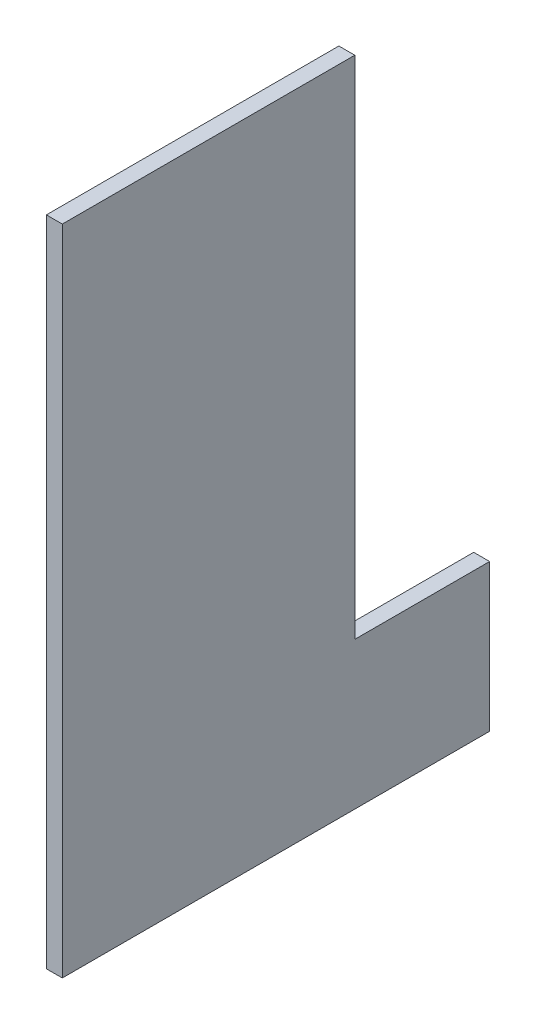
ISO-10303-21;
HEADER;
FILE_DESCRIPTION(('STEP AP214'),'2;1');
FILE_NAME('part.step','',(''),(''),'','','');
FILE_SCHEMA(('AUTOMOTIVE_DESIGN { 1 0 10303 214 1 1 1 1 }'));
ENDSEC;
DATA;
#1=APPLICATION_CONTEXT('core data for automotive mechanical design processes');
#2=APPLICATION_PROTOCOL_DEFINITION('international standard','automotive_design',2000,#1);
#3=PRODUCT_CONTEXT('',#1,'mechanical');
#4=PRODUCT('Part','Part','',(#3));
#5=PRODUCT_RELATED_PRODUCT_CATEGORY('part','',(#4));
#6=PRODUCT_DEFINITION_FORMATION('','',#4);
#7=PRODUCT_DEFINITION_CONTEXT('part definition',#1,'design');
#8=PRODUCT_DEFINITION('design','',#6,#7);
#9=PRODUCT_DEFINITION_SHAPE('','',#8);
#10=(LENGTH_UNIT() NAMED_UNIT(*) SI_UNIT(.MILLI.,.METRE.));
#11=(NAMED_UNIT(*) PLANE_ANGLE_UNIT() SI_UNIT($,.RADIAN.));
#12=(NAMED_UNIT(*) SI_UNIT($,.STERADIAN.) SOLID_ANGLE_UNIT());
#13=UNCERTAINTY_MEASURE_WITH_UNIT(LENGTH_MEASURE(1.E-05),#10,'distance_accuracy_value','');
#14=(GEOMETRIC_REPRESENTATION_CONTEXT(3) GLOBAL_UNCERTAINTY_ASSIGNED_CONTEXT((#13)) GLOBAL_UNIT_ASSIGNED_CONTEXT((#10,
#11,#12)) REPRESENTATION_CONTEXT('',''));
#15=CARTESIAN_POINT('',(0.,0.,0.));
#16=DIRECTION('',(0.,0.,1.));
#17=DIRECTION('',(1.,0.,0.));
#18=AXIS2_PLACEMENT_3D('',#15,#16,#17);
#19=CARTESIAN_POINT('',(-1370.,571.,1100.));
#20=DIRECTION('',(0.,-1.,0.));
#21=DIRECTION('',(0.,0.,1.));
#22=AXIS2_PLACEMENT_3D('',#19,#20,#21);
#23=PLANE('',#22);
#24=DIRECTION('',(0.,0.,-1.));
#25=VECTOR('',#24,1.);
#26=CARTESIAN_POINT('',(-1370.,571.,1100.));
#27=LINE('',#26,#25);
#28=CARTESIAN_POINT('',(-1370.,571.,1100.));
#29=VERTEX_POINT('',#28);
#30=CARTESIAN_POINT('',(-1370.,571.,549.));
#31=VERTEX_POINT('',#30);
#32=EDGE_CURVE('E99',#29,#31,#27,.T.);
#33=ORIENTED_EDGE('',*,*,#32,.F.);
#34=DIRECTION('',(-1.,0.,0.));
#35=VECTOR('',#34,1.);
#36=CARTESIAN_POINT('',(-1340.,571.,1100.));
#37=LINE('',#36,#35);
#38=CARTESIAN_POINT('',(-1340.,571.,1100.));
#39=VERTEX_POINT('',#38);
#40=EDGE_CURVE('E36',#39,#29,#37,.T.);
#41=ORIENTED_EDGE('',*,*,#40,.F.);
#42=DIRECTION('',(0.,0.,1.));
#43=VECTOR('',#42,1.);
#44=CARTESIAN_POINT('',(-1340.,571.,549.));
#45=LINE('',#44,#43);
#46=CARTESIAN_POINT('',(-1340.,571.,549.));
#47=VERTEX_POINT('',#46);
#48=EDGE_CURVE('E93',#47,#39,#45,.T.);
#49=ORIENTED_EDGE('',*,*,#48,.F.);
#50=DIRECTION('',(1.,0.,0.));
#51=VECTOR('',#50,1.);
#52=CARTESIAN_POINT('',(-1370.,571.,549.));
#53=LINE('',#52,#51);
#54=EDGE_CURVE('E27',#31,#47,#53,.T.);
#55=ORIENTED_EDGE('',*,*,#54,.F.);
#56=EDGE_LOOP('',(#33,#41,#49,#55));
#57=FACE_BOUND('',#56,.T.);
#58=ADVANCED_FACE('F17',(#57),#23,.F.);
#59=CARTESIAN_POINT('',(-1370.,-382.,549.));
#60=DIRECTION('',(0.,0.,1.));
#61=DIRECTION('',(0.,-1.,0.));
#62=AXIS2_PLACEMENT_3D('',#59,#60,#61);
#63=PLANE('',#62);
#64=DIRECTION('',(0.,-1.,0.));
#65=VECTOR('',#64,1.);
#66=CARTESIAN_POINT('',(-1340.,571.,549.));
#67=LINE('',#66,#65);
#68=CARTESIAN_POINT('',(-1340.,-382.,549.));
#69=VERTEX_POINT('',#68);
#70=EDGE_CURVE('E11',#47,#69,#67,.T.);
#71=ORIENTED_EDGE('',*,*,#70,.T.);
#72=DIRECTION('',(1.,0.,0.));
#73=VECTOR('',#72,1.);
#74=CARTESIAN_POINT('',(-1370.,-382.,549.));
#75=LINE('',#74,#73);
#76=CARTESIAN_POINT('',(-1370.,-382.,549.));
#77=VERTEX_POINT('',#76);
#78=EDGE_CURVE('E79',#77,#69,#75,.T.);
#79=ORIENTED_EDGE('',*,*,#78,.F.);
#80=DIRECTION('',(0.,-1.,0.));
#81=VECTOR('',#80,1.);
#82=CARTESIAN_POINT('',(-1370.,571.,549.));
#83=LINE('',#82,#81);
#84=EDGE_CURVE('E100',#31,#77,#83,.T.);
#85=ORIENTED_EDGE('',*,*,#84,.F.);
#86=ORIENTED_EDGE('',*,*,#54,.T.);
#87=EDGE_LOOP('',(#71,#79,#85,#86));
#88=FACE_BOUND('',#87,.T.);
#89=ADVANCED_FACE('F91',(#88),#63,.F.);
#90=CARTESIAN_POINT('',(-1370.,571.,1100.));
#91=DIRECTION('',(-1.,0.,0.));
#92=DIRECTION('',(0.,-1.,0.));
#93=AXIS2_PLACEMENT_3D('',#90,#91,#92);
#94=PLANE('',#93);
#95=DIRECTION('',(0.,0.,-1.));
#96=VECTOR('',#95,1.);
#97=CARTESIAN_POINT('',(-1370.,-659.,1100.));
#98=LINE('',#97,#96);
#99=CARTESIAN_POINT('',(-1370.,-659.,1100.));
#100=VERTEX_POINT('',#99);
#101=CARTESIAN_POINT('',(-1370.,-659.,295.));
#102=VERTEX_POINT('',#101);
#103=EDGE_CURVE('E108',#100,#102,#98,.T.);
#104=ORIENTED_EDGE('',*,*,#103,.F.);
#105=DIRECTION('',(0.,-1.,0.));
#106=VECTOR('',#105,1.);
#107=CARTESIAN_POINT('',(-1370.,571.,1100.));
#108=LINE('',#107,#106);
#109=EDGE_CURVE('E95',#29,#100,#108,.T.);
#110=ORIENTED_EDGE('',*,*,#109,.F.);
#111=ORIENTED_EDGE('',*,*,#32,.T.);
#112=ORIENTED_EDGE('',*,*,#84,.T.);
#113=DIRECTION('',(0.,0.,1.));
#114=VECTOR('',#113,1.);
#115=CARTESIAN_POINT('',(-1370.,-382.,295.));
#116=LINE('',#115,#114);
#117=CARTESIAN_POINT('',(-1370.,-382.,295.));
#118=VERTEX_POINT('',#117);
#119=EDGE_CURVE('E84',#118,#77,#116,.T.);
#120=ORIENTED_EDGE('',*,*,#119,.F.);
#121=DIRECTION('',(0.,1.,0.));
#122=VECTOR('',#121,1.);
#123=CARTESIAN_POINT('',(-1370.,-659.,295.));
#124=LINE('',#123,#122);
#125=EDGE_CURVE('E104',#102,#118,#124,.T.);
#126=ORIENTED_EDGE('',*,*,#125,.F.);
#127=EDGE_LOOP('',(#104,#110,#111,#112,#120,#126));
#128=FACE_BOUND('',#127,.T.);
#129=ADVANCED_FACE('F138',(#128),#94,.T.);
#130=CARTESIAN_POINT('',(-1370.,-659.,295.));
#131=DIRECTION('',(0.,0.,1.));
#132=DIRECTION('',(0.,-1.,0.));
#133=AXIS2_PLACEMENT_3D('',#130,#131,#132);
#134=PLANE('',#133);
#135=ORIENTED_EDGE('',*,*,#125,.T.);
#136=DIRECTION('',(1.,0.,0.));
#137=VECTOR('',#136,1.);
#138=CARTESIAN_POINT('',(-1370.,-382.,295.));
#139=LINE('',#138,#137);
#140=CARTESIAN_POINT('',(-1340.,-382.,295.));
#141=VERTEX_POINT('',#140);
#142=EDGE_CURVE('E21',#118,#141,#139,.T.);
#143=ORIENTED_EDGE('',*,*,#142,.T.);
#144=DIRECTION('',(0.,1.,0.));
#145=VECTOR('',#144,1.);
#146=CARTESIAN_POINT('',(-1340.,-659.,295.));
#147=LINE('',#146,#145);
#148=CARTESIAN_POINT('',(-1340.,-659.,295.));
#149=VERTEX_POINT('',#148);
#150=EDGE_CURVE('E64',#149,#141,#147,.T.);
#151=ORIENTED_EDGE('',*,*,#150,.F.);
#152=DIRECTION('',(1.,0.,0.));
#153=VECTOR('',#152,1.);
#154=CARTESIAN_POINT('',(-1370.,-659.,295.));
#155=LINE('',#154,#153);
#156=EDGE_CURVE('E110',#102,#149,#155,.T.);
#157=ORIENTED_EDGE('',*,*,#156,.F.);
#158=EDGE_LOOP('',(#135,#143,#151,#157));
#159=FACE_BOUND('',#158,.T.);
#160=ADVANCED_FACE('F129',(#159),#134,.F.);
#161=CARTESIAN_POINT('',(-1370.,-659.,1100.));
#162=DIRECTION('',(0.,-1.,0.));
#163=DIRECTION('',(0.,0.,1.));
#164=AXIS2_PLACEMENT_3D('',#161,#162,#163);
#165=PLANE('',#164);
#166=DIRECTION('',(0.,0.,1.));
#167=VECTOR('',#166,1.);
#168=CARTESIAN_POINT('',(-1340.,-659.,295.));
#169=LINE('',#168,#167);
#170=CARTESIAN_POINT('',(-1340.,-659.,1100.));
#171=VERTEX_POINT('',#170);
#172=EDGE_CURVE('E114',#149,#171,#169,.T.);
#173=ORIENTED_EDGE('',*,*,#172,.T.);
#174=DIRECTION('',(-1.,0.,0.));
#175=VECTOR('',#174,1.);
#176=CARTESIAN_POINT('',(-1340.,-659.,1100.));
#177=LINE('',#176,#175);
#178=EDGE_CURVE('E73',#171,#100,#177,.T.);
#179=ORIENTED_EDGE('',*,*,#178,.T.);
#180=ORIENTED_EDGE('',*,*,#103,.T.);
#181=ORIENTED_EDGE('',*,*,#156,.T.);
#182=EDGE_LOOP('',(#173,#179,#180,#181));
#183=FACE_BOUND('',#182,.T.);
#184=ADVANCED_FACE('F118',(#183),#165,.T.);
#185=CARTESIAN_POINT('',(-1340.,571.,1100.));
#186=DIRECTION('',(0.,0.,1.));
#187=DIRECTION('',(0.,-1.,0.));
#188=AXIS2_PLACEMENT_3D('',#185,#186,#187);
#189=PLANE('',#188);
#190=ORIENTED_EDGE('',*,*,#109,.T.);
#191=ORIENTED_EDGE('',*,*,#178,.F.);
#192=DIRECTION('',(0.,-1.,0.));
#193=VECTOR('',#192,1.);
#194=CARTESIAN_POINT('',(-1340.,571.,1100.));
#195=LINE('',#194,#193);
#196=EDGE_CURVE('E97',#39,#171,#195,.T.);
#197=ORIENTED_EDGE('',*,*,#196,.F.);
#198=ORIENTED_EDGE('',*,*,#40,.T.);
#199=EDGE_LOOP('',(#190,#191,#197,#198));
#200=FACE_BOUND('',#199,.T.);
#201=ADVANCED_FACE('F122',(#200),#189,.T.);
#202=CARTESIAN_POINT('',(-1340.,571.,160.));
#203=DIRECTION('',(1.,0.,0.));
#204=DIRECTION('',(0.,0.,-1.));
#205=AXIS2_PLACEMENT_3D('',#202,#203,#204);
#206=PLANE('',#205);
#207=DIRECTION('',(0.,0.,1.));
#208=VECTOR('',#207,1.);
#209=CARTESIAN_POINT('',(-1340.,-382.,295.));
#210=LINE('',#209,#208);
#211=EDGE_CURVE('E82',#141,#69,#210,.T.);
#212=ORIENTED_EDGE('',*,*,#211,.T.);
#213=ORIENTED_EDGE('',*,*,#70,.F.);
#214=ORIENTED_EDGE('',*,*,#48,.T.);
#215=ORIENTED_EDGE('',*,*,#196,.T.);
#216=ORIENTED_EDGE('',*,*,#172,.F.);
#217=ORIENTED_EDGE('',*,*,#150,.T.);
#218=EDGE_LOOP('',(#212,#213,#214,#215,#216,#217));
#219=FACE_BOUND('',#218,.T.);
#220=ADVANCED_FACE('F19',(#219),#206,.T.);
#221=CARTESIAN_POINT('',(-1370.,-382.,295.));
#222=DIRECTION('',(0.,-1.,0.));
#223=DIRECTION('',(0.,0.,1.));
#224=AXIS2_PLACEMENT_3D('',#221,#222,#223);
#225=PLANE('',#224);
#226=ORIENTED_EDGE('',*,*,#78,.T.);
#227=ORIENTED_EDGE('',*,*,#211,.F.);
#228=ORIENTED_EDGE('',*,*,#142,.F.);
#229=ORIENTED_EDGE('',*,*,#119,.T.);
#230=EDGE_LOOP('',(#226,#227,#228,#229));
#231=FACE_BOUND('',#230,.T.);
#232=ADVANCED_FACE('F80',(#231),#225,.F.);
#233=CLOSED_SHELL('',(#58,#89,#129,#160,#184,#201,#220,#232));
#234=MANIFOLD_SOLID_BREP('B1',#233);
#235=ADVANCED_BREP_SHAPE_REPRESENTATION('',(#18,#234),#14);
#236=SHAPE_DEFINITION_REPRESENTATION(#9,#235);
ENDSEC;
END-ISO-10303-21;
